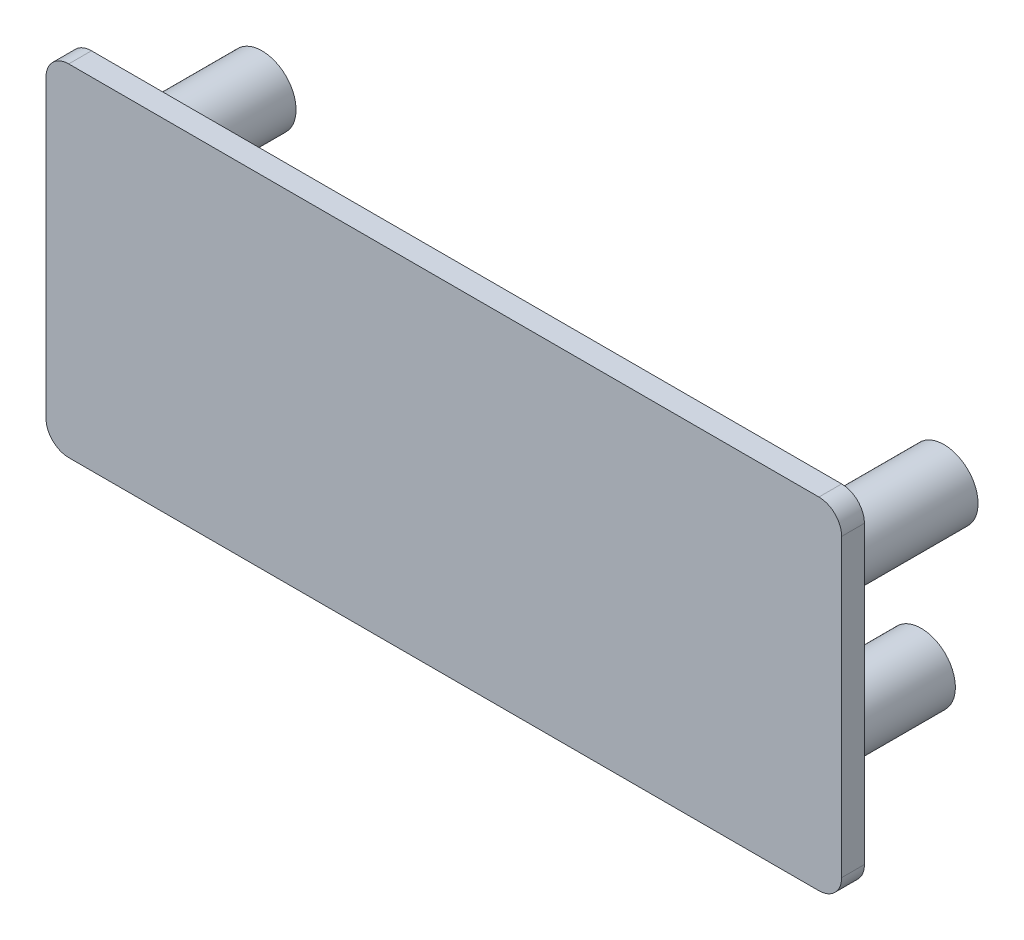
ISO-10303-21;
HEADER;
FILE_DESCRIPTION(('STEP AP214'),'2;1');
FILE_NAME('part.step','',(''),(''),'','','');
FILE_SCHEMA(('AUTOMOTIVE_DESIGN { 1 0 10303 214 1 1 1 1 }'));
ENDSEC;
DATA;
#1=APPLICATION_CONTEXT('core data for automotive mechanical design processes');
#2=APPLICATION_PROTOCOL_DEFINITION('international standard','automotive_design',2000,#1);
#3=PRODUCT_CONTEXT('',#1,'mechanical');
#4=PRODUCT('Part','Part','',(#3));
#5=PRODUCT_RELATED_PRODUCT_CATEGORY('part','',(#4));
#6=PRODUCT_DEFINITION_FORMATION('','',#4);
#7=PRODUCT_DEFINITION_CONTEXT('part definition',#1,'design');
#8=PRODUCT_DEFINITION('design','',#6,#7);
#9=PRODUCT_DEFINITION_SHAPE('','',#8);
#10=(LENGTH_UNIT() NAMED_UNIT(*) SI_UNIT(.MILLI.,.METRE.));
#11=(NAMED_UNIT(*) PLANE_ANGLE_UNIT() SI_UNIT($,.RADIAN.));
#12=(NAMED_UNIT(*) SI_UNIT($,.STERADIAN.) SOLID_ANGLE_UNIT());
#13=UNCERTAINTY_MEASURE_WITH_UNIT(LENGTH_MEASURE(1.E-05),#10,'distance_accuracy_value','');
#14=(GEOMETRIC_REPRESENTATION_CONTEXT(3) GLOBAL_UNCERTAINTY_ASSIGNED_CONTEXT((#13)) GLOBAL_UNIT_ASSIGNED_CONTEXT((#10,
#11,#12)) REPRESENTATION_CONTEXT('',''));
#15=CARTESIAN_POINT('',(0.,0.,0.));
#16=DIRECTION('',(0.,0.,1.));
#17=DIRECTION('',(1.,0.,0.));
#18=AXIS2_PLACEMENT_3D('',#15,#16,#17);
#19=CARTESIAN_POINT('',(-33.,-13.,2.));
#20=DIRECTION('',(0.,0.,-1.));
#21=DIRECTION('',(-1.,0.,0.));
#22=AXIS2_PLACEMENT_3D('',#19,#20,#21);
#23=CYLINDRICAL_SURFACE('',#22,2.);
#24=CARTESIAN_POINT('',(-33.,-13.,0.));
#25=DIRECTION('',(0.,0.,1.));
#26=DIRECTION('',(-1.,0.,0.));
#27=AXIS2_PLACEMENT_3D('',#24,#25,#26);
#28=CIRCLE('',#27,2.);
#29=CARTESIAN_POINT('',(-35.,-13.,0.));
#30=VERTEX_POINT('',#29);
#31=CARTESIAN_POINT('',(-33.,-15.,0.));
#32=VERTEX_POINT('',#31);
#33=EDGE_CURVE('E136',#30,#32,#28,.T.);
#34=ORIENTED_EDGE('',*,*,#33,.T.);
#35=DIRECTION('',(0.,0.,-1.));
#36=VECTOR('',#35,1.);
#37=CARTESIAN_POINT('',(-33.,-15.,2.));
#38=LINE('',#37,#36);
#39=CARTESIAN_POINT('',(-33.,-15.,2.));
#40=VERTEX_POINT('',#39);
#41=EDGE_CURVE('E164',#40,#32,#38,.T.);
#42=ORIENTED_EDGE('',*,*,#41,.F.);
#43=CARTESIAN_POINT('',(-33.,-13.,2.));
#44=DIRECTION('',(0.,0.,1.));
#45=DIRECTION('',(-1.,0.,0.));
#46=AXIS2_PLACEMENT_3D('',#43,#44,#45);
#47=CIRCLE('',#46,2.);
#48=CARTESIAN_POINT('',(-35.,-13.,2.));
#49=VERTEX_POINT('',#48);
#50=EDGE_CURVE('E151',#49,#40,#47,.T.);
#51=ORIENTED_EDGE('',*,*,#50,.F.);
#52=DIRECTION('',(0.,0.,-1.));
#53=VECTOR('',#52,1.);
#54=CARTESIAN_POINT('',(-35.,-13.,2.));
#55=LINE('',#54,#53);
#56=EDGE_CURVE('E132',#49,#30,#55,.T.);
#57=ORIENTED_EDGE('',*,*,#56,.T.);
#58=EDGE_LOOP('',(#34,#42,#51,#57));
#59=FACE_BOUND('',#58,.T.);
#60=ADVANCED_FACE('F39',(#59),#23,.T.);
#61=CARTESIAN_POINT('',(-33.,-15.,2.));
#62=DIRECTION('',(0.,1.,0.));
#63=DIRECTION('',(0.,0.,1.));
#64=AXIS2_PLACEMENT_3D('',#61,#62,#63);
#65=PLANE('',#64);
#66=DIRECTION('',(1.,0.,0.));
#67=VECTOR('',#66,1.);
#68=CARTESIAN_POINT('',(-33.,-15.,0.));
#69=LINE('',#68,#67);
#70=CARTESIAN_POINT('',(33.,-15.,0.));
#71=VERTEX_POINT('',#70);
#72=EDGE_CURVE('E139',#32,#71,#69,.T.);
#73=ORIENTED_EDGE('',*,*,#72,.T.);
#74=DIRECTION('',(0.,0.,-1.));
#75=VECTOR('',#74,1.);
#76=CARTESIAN_POINT('',(33.,-15.,2.));
#77=LINE('',#76,#75);
#78=CARTESIAN_POINT('',(33.,-15.,2.));
#79=VERTEX_POINT('',#78);
#80=EDGE_CURVE('E161',#79,#71,#77,.T.);
#81=ORIENTED_EDGE('',*,*,#80,.F.);
#82=DIRECTION('',(1.,0.,0.));
#83=VECTOR('',#82,1.);
#84=CARTESIAN_POINT('',(-33.,-15.,2.));
#85=LINE('',#84,#83);
#86=EDGE_CURVE('E99',#40,#79,#85,.T.);
#87=ORIENTED_EDGE('',*,*,#86,.F.);
#88=ORIENTED_EDGE('',*,*,#41,.T.);
#89=EDGE_LOOP('',(#73,#81,#87,#88));
#90=FACE_BOUND('',#89,.T.);
#91=ADVANCED_FACE('F204',(#90),#65,.F.);
#92=CARTESIAN_POINT('',(33.,-13.,2.));
#93=DIRECTION('',(0.,0.,-1.));
#94=DIRECTION('',(-1.,0.,0.));
#95=AXIS2_PLACEMENT_3D('',#92,#93,#94);
#96=CYLINDRICAL_SURFACE('',#95,2.);
#97=CARTESIAN_POINT('',(33.,-13.,0.));
#98=DIRECTION('',(0.,0.,1.));
#99=DIRECTION('',(1.,0.,0.));
#100=AXIS2_PLACEMENT_3D('',#97,#98,#99);
#101=CIRCLE('',#100,2.);
#102=CARTESIAN_POINT('',(35.,-13.,0.));
#103=VERTEX_POINT('',#102);
#104=EDGE_CURVE('E142',#71,#103,#101,.T.);
#105=ORIENTED_EDGE('',*,*,#104,.T.);
#106=DIRECTION('',(0.,0.,-1.));
#107=VECTOR('',#106,1.);
#108=CARTESIAN_POINT('',(35.,-13.,2.));
#109=LINE('',#108,#107);
#110=CARTESIAN_POINT('',(35.,-13.,2.));
#111=VERTEX_POINT('',#110);
#112=EDGE_CURVE('E158',#111,#103,#109,.T.);
#113=ORIENTED_EDGE('',*,*,#112,.F.);
#114=CARTESIAN_POINT('',(33.,-13.,2.));
#115=DIRECTION('',(0.,0.,1.));
#116=DIRECTION('',(1.,0.,0.));
#117=AXIS2_PLACEMENT_3D('',#114,#115,#116);
#118=CIRCLE('',#117,2.);
#119=EDGE_CURVE('E219',#79,#111,#118,.T.);
#120=ORIENTED_EDGE('',*,*,#119,.F.);
#121=ORIENTED_EDGE('',*,*,#80,.T.);
#122=EDGE_LOOP('',(#105,#113,#120,#121));
#123=FACE_BOUND('',#122,.T.);
#124=ADVANCED_FACE('F209',(#123),#96,.T.);
#125=CARTESIAN_POINT('',(35.,-13.,2.));
#126=DIRECTION('',(-1.,0.,0.));
#127=DIRECTION('',(0.,0.,1.));
#128=AXIS2_PLACEMENT_3D('',#125,#126,#127);
#129=PLANE('',#128);
#130=DIRECTION('',(0.,1.,0.));
#131=VECTOR('',#130,1.);
#132=CARTESIAN_POINT('',(35.,-13.,0.));
#133=LINE('',#132,#131);
#134=CARTESIAN_POINT('',(35.,13.,0.));
#135=VERTEX_POINT('',#134);
#136=EDGE_CURVE('E144',#103,#135,#133,.T.);
#137=ORIENTED_EDGE('',*,*,#136,.T.);
#138=DIRECTION('',(0.,0.,-1.));
#139=VECTOR('',#138,1.);
#140=CARTESIAN_POINT('',(35.,13.,2.));
#141=LINE('',#140,#139);
#142=CARTESIAN_POINT('',(35.,13.,2.));
#143=VERTEX_POINT('',#142);
#144=EDGE_CURVE('E155',#143,#135,#141,.T.);
#145=ORIENTED_EDGE('',*,*,#144,.F.);
#146=DIRECTION('',(0.,1.,0.));
#147=VECTOR('',#146,1.);
#148=CARTESIAN_POINT('',(35.,-13.,2.));
#149=LINE('',#148,#147);
#150=EDGE_CURVE('E221',#111,#143,#149,.T.);
#151=ORIENTED_EDGE('',*,*,#150,.F.);
#152=ORIENTED_EDGE('',*,*,#112,.T.);
#153=EDGE_LOOP('',(#137,#145,#151,#152));
#154=FACE_BOUND('',#153,.T.);
#155=ADVANCED_FACE('F300',(#154),#129,.F.);
#156=CARTESIAN_POINT('',(33.,13.,2.));
#157=DIRECTION('',(0.,0.,-1.));
#158=DIRECTION('',(-1.,0.,0.));
#159=AXIS2_PLACEMENT_3D('',#156,#157,#158);
#160=CYLINDRICAL_SURFACE('',#159,2.);
#161=CARTESIAN_POINT('',(33.,13.,0.));
#162=DIRECTION('',(0.,0.,1.));
#163=DIRECTION('',(-1.,0.,0.));
#164=AXIS2_PLACEMENT_3D('',#161,#162,#163);
#165=CIRCLE('',#164,2.);
#166=CARTESIAN_POINT('',(33.,15.,0.));
#167=VERTEX_POINT('',#166);
#168=EDGE_CURVE('E146',#135,#167,#165,.T.);
#169=ORIENTED_EDGE('',*,*,#168,.T.);
#170=DIRECTION('',(0.,0.,-1.));
#171=VECTOR('',#170,1.);
#172=CARTESIAN_POINT('',(33.,15.,2.));
#173=LINE('',#172,#171);
#174=CARTESIAN_POINT('',(33.,15.,2.));
#175=VERTEX_POINT('',#174);
#176=EDGE_CURVE('E127',#175,#167,#173,.T.);
#177=ORIENTED_EDGE('',*,*,#176,.F.);
#178=CARTESIAN_POINT('',(33.,13.,2.));
#179=DIRECTION('',(0.,0.,1.));
#180=DIRECTION('',(-1.,0.,0.));
#181=AXIS2_PLACEMENT_3D('',#178,#179,#180);
#182=CIRCLE('',#181,2.);
#183=EDGE_CURVE('E118',#143,#175,#182,.T.);
#184=ORIENTED_EDGE('',*,*,#183,.F.);
#185=ORIENTED_EDGE('',*,*,#144,.T.);
#186=EDGE_LOOP('',(#169,#177,#184,#185));
#187=FACE_BOUND('',#186,.T.);
#188=ADVANCED_FACE('F297',(#187),#160,.T.);
#189=CARTESIAN_POINT('',(-33.,15.,2.));
#190=DIRECTION('',(0.,-1.,0.));
#191=DIRECTION('',(0.,0.,-1.));
#192=AXIS2_PLACEMENT_3D('',#189,#190,#191);
#193=PLANE('',#192);
#194=DIRECTION('',(-1.,0.,0.));
#195=VECTOR('',#194,1.);
#196=CARTESIAN_POINT('',(-33.,15.,0.));
#197=LINE('',#196,#195);
#198=CARTESIAN_POINT('',(-33.,15.,0.));
#199=VERTEX_POINT('',#198);
#200=EDGE_CURVE('E126',#167,#199,#197,.T.);
#201=ORIENTED_EDGE('',*,*,#200,.T.);
#202=DIRECTION('',(0.,0.,-1.));
#203=VECTOR('',#202,1.);
#204=CARTESIAN_POINT('',(-33.,15.,2.));
#205=LINE('',#204,#203);
#206=CARTESIAN_POINT('',(-33.,15.,2.));
#207=VERTEX_POINT('',#206);
#208=EDGE_CURVE('E123',#207,#199,#205,.T.);
#209=ORIENTED_EDGE('',*,*,#208,.F.);
#210=DIRECTION('',(-1.,0.,0.));
#211=VECTOR('',#210,1.);
#212=CARTESIAN_POINT('',(-33.,15.,2.));
#213=LINE('',#212,#211);
#214=EDGE_CURVE('E112',#175,#207,#213,.T.);
#215=ORIENTED_EDGE('',*,*,#214,.F.);
#216=ORIENTED_EDGE('',*,*,#176,.T.);
#217=EDGE_LOOP('',(#201,#209,#215,#216));
#218=FACE_BOUND('',#217,.T.);
#219=ADVANCED_FACE('F124',(#218),#193,.F.);
#220=CARTESIAN_POINT('',(-33.,13.,2.));
#221=DIRECTION('',(0.,0.,-1.));
#222=DIRECTION('',(-1.,0.,0.));
#223=AXIS2_PLACEMENT_3D('',#220,#221,#222);
#224=CYLINDRICAL_SURFACE('',#223,2.);
#225=CARTESIAN_POINT('',(-33.,13.,0.));
#226=DIRECTION('',(0.,0.,1.));
#227=DIRECTION('',(-1.,0.,0.));
#228=AXIS2_PLACEMENT_3D('',#225,#226,#227);
#229=CIRCLE('',#228,2.);
#230=CARTESIAN_POINT('',(-35.,13.,0.));
#231=VERTEX_POINT('',#230);
#232=EDGE_CURVE('E84',#199,#231,#229,.T.);
#233=ORIENTED_EDGE('',*,*,#232,.T.);
#234=DIRECTION('',(0.,0.,-1.));
#235=VECTOR('',#234,1.);
#236=CARTESIAN_POINT('',(-35.,13.,2.));
#237=LINE('',#236,#235);
#238=CARTESIAN_POINT('',(-35.,13.,2.));
#239=VERTEX_POINT('',#238);
#240=EDGE_CURVE('E128',#239,#231,#237,.T.);
#241=ORIENTED_EDGE('',*,*,#240,.F.);
#242=CARTESIAN_POINT('',(-33.,13.,2.));
#243=DIRECTION('',(0.,0.,1.));
#244=DIRECTION('',(-1.,0.,0.));
#245=AXIS2_PLACEMENT_3D('',#242,#243,#244);
#246=CIRCLE('',#245,2.);
#247=EDGE_CURVE('E116',#207,#239,#246,.T.);
#248=ORIENTED_EDGE('',*,*,#247,.F.);
#249=ORIENTED_EDGE('',*,*,#208,.T.);
#250=EDGE_LOOP('',(#233,#241,#248,#249));
#251=FACE_BOUND('',#250,.T.);
#252=ADVANCED_FACE('F130',(#251),#224,.T.);
#253=CARTESIAN_POINT('',(-35.,-13.,2.));
#254=DIRECTION('',(1.,0.,0.));
#255=DIRECTION('',(0.,0.,-1.));
#256=AXIS2_PLACEMENT_3D('',#253,#254,#255);
#257=PLANE('',#256);
#258=DIRECTION('',(0.,-1.,0.));
#259=VECTOR('',#258,1.);
#260=CARTESIAN_POINT('',(-35.,-13.,0.));
#261=LINE('',#260,#259);
#262=EDGE_CURVE('E90',#231,#30,#261,.T.);
#263=ORIENTED_EDGE('',*,*,#262,.T.);
#264=ORIENTED_EDGE('',*,*,#56,.F.);
#265=DIRECTION('',(0.,-1.,0.));
#266=VECTOR('',#265,1.);
#267=CARTESIAN_POINT('',(-35.,-13.,2.));
#268=LINE('',#267,#266);
#269=EDGE_CURVE('E55',#239,#49,#268,.T.);
#270=ORIENTED_EDGE('',*,*,#269,.F.);
#271=ORIENTED_EDGE('',*,*,#240,.T.);
#272=EDGE_LOOP('',(#263,#264,#270,#271));
#273=FACE_BOUND('',#272,.T.);
#274=ADVANCED_FACE('F286',(#273),#257,.F.);
#275=CARTESIAN_POINT('',(-33.,-13.,2.));
#276=DIRECTION('',(0.,0.,-1.));
#277=DIRECTION('',(-1.,0.,0.));
#278=AXIS2_PLACEMENT_3D('',#275,#276,#277);
#279=PLANE('',#278);
#280=ORIENTED_EDGE('',*,*,#50,.T.);
#281=ORIENTED_EDGE('',*,*,#86,.T.);
#282=ORIENTED_EDGE('',*,*,#119,.T.);
#283=ORIENTED_EDGE('',*,*,#150,.T.);
#284=ORIENTED_EDGE('',*,*,#183,.T.);
#285=ORIENTED_EDGE('',*,*,#214,.T.);
#286=ORIENTED_EDGE('',*,*,#247,.T.);
#287=ORIENTED_EDGE('',*,*,#269,.T.);
#288=EDGE_LOOP('',(#280,#281,#282,#283,#284,#285,#286,#287));
#289=FACE_BOUND('',#288,.T.);
#290=ADVANCED_FACE('F114',(#289),#279,.F.);
#291=CARTESIAN_POINT('',(-33.,-13.,0.));
#292=DIRECTION('',(0.,0.,-1.));
#293=DIRECTION('',(-1.,0.,0.));
#294=AXIS2_PLACEMENT_3D('',#291,#292,#293);
#295=PLANE('',#294);
#296=CARTESIAN_POINT('',(28.,-7.50000000000001,0.));
#297=DIRECTION('',(0.,0.,-1.));
#298=DIRECTION('',(-1.,0.,0.));
#299=AXIS2_PLACEMENT_3D('',#296,#297,#298);
#300=CIRCLE('',#299,3.);
#301=CARTESIAN_POINT('',(25.,-7.50000000000001,0.));
#302=VERTEX_POINT('',#301);
#303=EDGE_CURVE('E240',#302,#302,#300,.T.);
#304=ORIENTED_EDGE('',*,*,#303,.F.);
#305=EDGE_LOOP('',(#304));
#306=FACE_BOUND('',#305,.T.);
#307=CARTESIAN_POINT('',(30.,7.5,0.));
#308=DIRECTION('',(0.,0.,-1.));
#309=DIRECTION('',(-1.,0.,0.));
#310=AXIS2_PLACEMENT_3D('',#307,#308,#309);
#311=CIRCLE('',#310,2.99999999999999);
#312=CARTESIAN_POINT('',(27.,7.5,0.));
#313=VERTEX_POINT('',#312);
#314=EDGE_CURVE('E250',#313,#313,#311,.T.);
#315=ORIENTED_EDGE('',*,*,#314,.F.);
#316=EDGE_LOOP('',(#315));
#317=FACE_BOUND('',#316,.T.);
#318=CARTESIAN_POINT('',(-30.,7.5,0.));
#319=DIRECTION('',(0.,0.,-1.));
#320=DIRECTION('',(-1.,0.,0.));
#321=AXIS2_PLACEMENT_3D('',#318,#319,#320);
#322=CIRCLE('',#321,3.);
#323=CARTESIAN_POINT('',(-33.,7.5,0.));
#324=VERTEX_POINT('',#323);
#325=EDGE_CURVE('E257',#324,#324,#322,.T.);
#326=ORIENTED_EDGE('',*,*,#325,.F.);
#327=EDGE_LOOP('',(#326));
#328=FACE_BOUND('',#327,.T.);
#329=CARTESIAN_POINT('',(-28.,-7.5,0.));
#330=DIRECTION('',(0.,0.,-1.));
#331=DIRECTION('',(-1.,0.,0.));
#332=AXIS2_PLACEMENT_3D('',#329,#330,#331);
#333=CIRCLE('',#332,3.);
#334=CARTESIAN_POINT('',(-31.,-7.5,0.));
#335=VERTEX_POINT('',#334);
#336=EDGE_CURVE('E227',#335,#335,#333,.T.);
#337=ORIENTED_EDGE('',*,*,#336,.F.);
#338=EDGE_LOOP('',(#337));
#339=FACE_BOUND('',#338,.T.);
#340=ORIENTED_EDGE('',*,*,#33,.F.);
#341=ORIENTED_EDGE('',*,*,#262,.F.);
#342=ORIENTED_EDGE('',*,*,#232,.F.);
#343=ORIENTED_EDGE('',*,*,#200,.F.);
#344=ORIENTED_EDGE('',*,*,#168,.F.);
#345=ORIENTED_EDGE('',*,*,#136,.F.);
#346=ORIENTED_EDGE('',*,*,#104,.F.);
#347=ORIENTED_EDGE('',*,*,#72,.F.);
#348=EDGE_LOOP('',(#340,#341,#342,#343,#344,#345,#346,#347));
#349=FACE_BOUND('',#348,.T.);
#350=ADVANCED_FACE('F192',(#306,#317,#328,#339,#349),#295,.T.);
#351=CARTESIAN_POINT('',(-28.,-7.5,-12.));
#352=DIRECTION('',(0.,0.,-1.));
#353=DIRECTION('',(-1.,0.,0.));
#354=AXIS2_PLACEMENT_3D('',#351,#352,#353);
#355=PLANE('',#354);
#356=CARTESIAN_POINT('',(-28.,-7.5,-12.));
#357=DIRECTION('',(0.,0.,-1.));
#358=DIRECTION('',(-1.,0.,0.));
#359=AXIS2_PLACEMENT_3D('',#356,#357,#358);
#360=CIRCLE('',#359,3.);
#361=CARTESIAN_POINT('',(-31.,-7.5,-12.));
#362=VERTEX_POINT('',#361);
#363=EDGE_CURVE('E140',#362,#362,#360,.T.);
#364=ORIENTED_EDGE('',*,*,#363,.T.);
#365=EDGE_LOOP('',(#364));
#366=FACE_BOUND('',#365,.T.);
#367=CARTESIAN_POINT('',(-28.,-7.5,-12.));
#368=DIRECTION('',(0.,0.,-1.));
#369=DIRECTION('',(-1.,0.,0.));
#370=AXIS2_PLACEMENT_3D('',#367,#368,#369);
#371=CIRCLE('',#370,1.95);
#372=CARTESIAN_POINT('',(-29.95,-7.5,-12.));
#373=VERTEX_POINT('',#372);
#374=EDGE_CURVE('E230',#373,#373,#371,.T.);
#375=ORIENTED_EDGE('',*,*,#374,.F.);
#376=EDGE_LOOP('',(#375));
#377=FACE_BOUND('',#376,.T.);
#378=ADVANCED_FACE('F267',(#366,#377),#355,.T.);
#379=CARTESIAN_POINT('',(-28.,-7.5,-12.));
#380=DIRECTION('',(0.,0.,1.));
#381=DIRECTION('',(1.,0.,0.));
#382=AXIS2_PLACEMENT_3D('',#379,#380,#381);
#383=CYLINDRICAL_SURFACE('',#382,3.);
#384=ORIENTED_EDGE('',*,*,#363,.F.);
#385=EDGE_LOOP('',(#384));
#386=FACE_BOUND('',#385,.T.);
#387=ORIENTED_EDGE('',*,*,#336,.T.);
#388=EDGE_LOOP('',(#387));
#389=FACE_BOUND('',#388,.T.);
#390=ADVANCED_FACE('F271',(#386,#389),#383,.T.);
#391=CARTESIAN_POINT('',(-28.,-7.5,-12.));
#392=DIRECTION('',(0.,0.,1.));
#393=DIRECTION('',(1.,0.,0.));
#394=AXIS2_PLACEMENT_3D('',#391,#392,#393);
#395=CYLINDRICAL_SURFACE('',#394,1.95);
#396=ORIENTED_EDGE('',*,*,#374,.T.);
#397=EDGE_LOOP('',(#396));
#398=FACE_BOUND('',#397,.T.);
#399=CARTESIAN_POINT('',(-28.,-7.5,0.));
#400=DIRECTION('',(0.,0.,-1.));
#401=DIRECTION('',(-1.,0.,0.));
#402=AXIS2_PLACEMENT_3D('',#399,#400,#401);
#403=CIRCLE('',#402,1.95);
#404=CARTESIAN_POINT('',(-29.95,-7.5,0.));
#405=VERTEX_POINT('',#404);
#406=EDGE_CURVE('E166',#405,#405,#403,.F.);
#407=ORIENTED_EDGE('',*,*,#406,.T.);
#408=EDGE_LOOP('',(#407));
#409=FACE_BOUND('',#408,.T.);
#410=ADVANCED_FACE('F273',(#398,#409),#395,.F.);
#411=ORIENTED_EDGE('',*,*,#406,.F.);
#412=EDGE_LOOP('',(#411));
#413=FACE_BOUND('',#412,.T.);
#414=ADVANCED_FACE('F199',(#413),#295,.T.);
#415=CARTESIAN_POINT('',(-30.,7.5,-12.));
#416=DIRECTION('',(0.,0.,-1.));
#417=DIRECTION('',(-1.,0.,0.));
#418=AXIS2_PLACEMENT_3D('',#415,#416,#417);
#419=PLANE('',#418);
#420=CARTESIAN_POINT('',(-30.,7.5,-12.));
#421=DIRECTION('',(0.,0.,-1.));
#422=DIRECTION('',(-1.,0.,0.));
#423=AXIS2_PLACEMENT_3D('',#420,#421,#422);
#424=CIRCLE('',#423,3.);
#425=CARTESIAN_POINT('',(-33.,7.5,-12.));
#426=VERTEX_POINT('',#425);
#427=EDGE_CURVE('E249',#426,#426,#424,.T.);
#428=ORIENTED_EDGE('',*,*,#427,.T.);
#429=EDGE_LOOP('',(#428));
#430=FACE_BOUND('',#429,.T.);
#431=CARTESIAN_POINT('',(-30.,7.5,-12.));
#432=DIRECTION('',(0.,0.,-1.));
#433=DIRECTION('',(-1.,0.,0.));
#434=AXIS2_PLACEMENT_3D('',#431,#432,#433);
#435=CIRCLE('',#434,1.95);
#436=CARTESIAN_POINT('',(-31.95,7.5,-12.));
#437=VERTEX_POINT('',#436);
#438=EDGE_CURVE('E235',#437,#437,#435,.T.);
#439=ORIENTED_EDGE('',*,*,#438,.F.);
#440=EDGE_LOOP('',(#439));
#441=FACE_BOUND('',#440,.T.);
#442=ADVANCED_FACE('F354',(#430,#441),#419,.T.);
#443=CARTESIAN_POINT('',(-30.,7.5,-12.));
#444=DIRECTION('',(0.,0.,1.));
#445=DIRECTION('',(1.,0.,0.));
#446=AXIS2_PLACEMENT_3D('',#443,#444,#445);
#447=CYLINDRICAL_SURFACE('',#446,3.);
#448=ORIENTED_EDGE('',*,*,#427,.F.);
#449=EDGE_LOOP('',(#448));
#450=FACE_BOUND('',#449,.T.);
#451=ORIENTED_EDGE('',*,*,#325,.T.);
#452=EDGE_LOOP('',(#451));
#453=FACE_BOUND('',#452,.T.);
#454=ADVANCED_FACE('F263',(#450,#453),#447,.T.);
#455=CARTESIAN_POINT('',(-30.,7.5,-12.));
#456=DIRECTION('',(0.,0.,1.));
#457=DIRECTION('',(1.,0.,0.));
#458=AXIS2_PLACEMENT_3D('',#455,#456,#457);
#459=CYLINDRICAL_SURFACE('',#458,1.95);
#460=ORIENTED_EDGE('',*,*,#438,.T.);
#461=EDGE_LOOP('',(#460));
#462=FACE_BOUND('',#461,.T.);
#463=CARTESIAN_POINT('',(-30.,7.5,0.));
#464=DIRECTION('',(0.,0.,-1.));
#465=DIRECTION('',(-1.,0.,0.));
#466=AXIS2_PLACEMENT_3D('',#463,#464,#465);
#467=CIRCLE('',#466,1.95);
#468=CARTESIAN_POINT('',(-31.95,7.5,0.));
#469=VERTEX_POINT('',#468);
#470=EDGE_CURVE('E169',#469,#469,#467,.F.);
#471=ORIENTED_EDGE('',*,*,#470,.T.);
#472=EDGE_LOOP('',(#471));
#473=FACE_BOUND('',#472,.T.);
#474=ADVANCED_FACE('F197',(#462,#473),#459,.F.);
#475=ORIENTED_EDGE('',*,*,#470,.F.);
#476=EDGE_LOOP('',(#475));
#477=FACE_BOUND('',#476,.T.);
#478=ADVANCED_FACE('F180',(#477),#295,.T.);
#479=CARTESIAN_POINT('',(30.,7.5,-12.));
#480=DIRECTION('',(0.,0.,-1.));
#481=DIRECTION('',(-1.,0.,0.));
#482=AXIS2_PLACEMENT_3D('',#479,#480,#481);
#483=PLANE('',#482);
#484=CARTESIAN_POINT('',(30.,7.5,-12.));
#485=DIRECTION('',(0.,0.,-1.));
#486=DIRECTION('',(-1.,0.,0.));
#487=AXIS2_PLACEMENT_3D('',#484,#485,#486);
#488=CIRCLE('',#487,2.99999999999999);
#489=CARTESIAN_POINT('',(27.,7.5,-12.));
#490=VERTEX_POINT('',#489);
#491=EDGE_CURVE('E239',#490,#490,#488,.T.);
#492=ORIENTED_EDGE('',*,*,#491,.T.);
#493=EDGE_LOOP('',(#492));
#494=FACE_BOUND('',#493,.T.);
#495=CARTESIAN_POINT('',(30.,7.5,-12.));
#496=DIRECTION('',(0.,0.,-1.));
#497=DIRECTION('',(-1.,0.,0.));
#498=AXIS2_PLACEMENT_3D('',#495,#496,#497);
#499=CIRCLE('',#498,1.95);
#500=CARTESIAN_POINT('',(28.05,7.5,-12.));
#501=VERTEX_POINT('',#500);
#502=EDGE_CURVE('E246',#501,#501,#499,.T.);
#503=ORIENTED_EDGE('',*,*,#502,.F.);
#504=EDGE_LOOP('',(#503));
#505=FACE_BOUND('',#504,.T.);
#506=ADVANCED_FACE('F196',(#494,#505),#483,.T.);
#507=CARTESIAN_POINT('',(30.,7.5,-12.));
#508=DIRECTION('',(0.,0.,1.));
#509=DIRECTION('',(1.,0.,0.));
#510=AXIS2_PLACEMENT_3D('',#507,#508,#509);
#511=CYLINDRICAL_SURFACE('',#510,2.99999999999999);
#512=ORIENTED_EDGE('',*,*,#491,.F.);
#513=EDGE_LOOP('',(#512));
#514=FACE_BOUND('',#513,.T.);
#515=ORIENTED_EDGE('',*,*,#314,.T.);
#516=EDGE_LOOP('',(#515));
#517=FACE_BOUND('',#516,.T.);
#518=ADVANCED_FACE('F189',(#514,#517),#511,.T.);
#519=CARTESIAN_POINT('',(30.,7.5,-12.));
#520=DIRECTION('',(0.,0.,1.));
#521=DIRECTION('',(1.,0.,0.));
#522=AXIS2_PLACEMENT_3D('',#519,#520,#521);
#523=CYLINDRICAL_SURFACE('',#522,1.95);
#524=ORIENTED_EDGE('',*,*,#502,.T.);
#525=EDGE_LOOP('',(#524));
#526=FACE_BOUND('',#525,.T.);
#527=CARTESIAN_POINT('',(30.,7.5,0.));
#528=DIRECTION('',(0.,0.,-1.));
#529=DIRECTION('',(-1.,0.,0.));
#530=AXIS2_PLACEMENT_3D('',#527,#528,#529);
#531=CIRCLE('',#530,1.95);
#532=CARTESIAN_POINT('',(28.05,7.5,0.));
#533=VERTEX_POINT('',#532);
#534=EDGE_CURVE('E47',#533,#533,#531,.F.);
#535=ORIENTED_EDGE('',*,*,#534,.T.);
#536=EDGE_LOOP('',(#535));
#537=FACE_BOUND('',#536,.T.);
#538=ADVANCED_FACE('F174',(#526,#537),#523,.F.);
#539=ORIENTED_EDGE('',*,*,#534,.F.);
#540=EDGE_LOOP('',(#539));
#541=FACE_BOUND('',#540,.T.);
#542=ADVANCED_FACE('F176',(#541),#295,.T.);
#543=CARTESIAN_POINT('',(28.,-7.50000000000001,-12.));
#544=DIRECTION('',(0.,0.,-1.));
#545=DIRECTION('',(-1.,0.,0.));
#546=AXIS2_PLACEMENT_3D('',#543,#544,#545);
#547=PLANE('',#546);
#548=CARTESIAN_POINT('',(28.,-7.50000000000001,-12.));
#549=DIRECTION('',(0.,0.,-1.));
#550=DIRECTION('',(-1.,0.,0.));
#551=AXIS2_PLACEMENT_3D('',#548,#549,#550);
#552=CIRCLE('',#551,3.);
#553=CARTESIAN_POINT('',(25.,-7.50000000000001,-12.));
#554=VERTEX_POINT('',#553);
#555=EDGE_CURVE('E241',#554,#554,#552,.T.);
#556=ORIENTED_EDGE('',*,*,#555,.T.);
#557=EDGE_LOOP('',(#556));
#558=FACE_BOUND('',#557,.T.);
#559=CARTESIAN_POINT('',(28.,-7.50000000000001,-12.));
#560=DIRECTION('',(0.,0.,-1.));
#561=DIRECTION('',(-1.,0.,0.));
#562=AXIS2_PLACEMENT_3D('',#559,#560,#561);
#563=CIRCLE('',#562,1.95);
#564=CARTESIAN_POINT('',(26.05,-7.50000000000001,-12.));
#565=VERTEX_POINT('',#564);
#566=EDGE_CURVE('E236',#565,#565,#563,.T.);
#567=ORIENTED_EDGE('',*,*,#566,.F.);
#568=EDGE_LOOP('',(#567));
#569=FACE_BOUND('',#568,.T.);
#570=ADVANCED_FACE('F178',(#558,#569),#547,.T.);
#571=CARTESIAN_POINT('',(28.,-7.50000000000001,-12.));
#572=DIRECTION('',(0.,0.,1.));
#573=DIRECTION('',(1.,0.,0.));
#574=AXIS2_PLACEMENT_3D('',#571,#572,#573);
#575=CYLINDRICAL_SURFACE('',#574,3.);
#576=ORIENTED_EDGE('',*,*,#555,.F.);
#577=EDGE_LOOP('',(#576));
#578=FACE_BOUND('',#577,.T.);
#579=ORIENTED_EDGE('',*,*,#303,.T.);
#580=EDGE_LOOP('',(#579));
#581=FACE_BOUND('',#580,.T.);
#582=ADVANCED_FACE('F186',(#578,#581),#575,.T.);
#583=CARTESIAN_POINT('',(28.,-7.50000000000001,-12.));
#584=DIRECTION('',(0.,0.,1.));
#585=DIRECTION('',(1.,0.,0.));
#586=AXIS2_PLACEMENT_3D('',#583,#584,#585);
#587=CYLINDRICAL_SURFACE('',#586,1.95);
#588=ORIENTED_EDGE('',*,*,#566,.T.);
#589=EDGE_LOOP('',(#588));
#590=FACE_BOUND('',#589,.T.);
#591=CARTESIAN_POINT('',(28.,-7.50000000000001,0.));
#592=DIRECTION('',(0.,0.,-1.));
#593=DIRECTION('',(-1.,0.,0.));
#594=AXIS2_PLACEMENT_3D('',#591,#592,#593);
#595=CIRCLE('',#594,1.95);
#596=CARTESIAN_POINT('',(26.05,-7.50000000000001,0.));
#597=VERTEX_POINT('',#596);
#598=EDGE_CURVE('E11',#597,#597,#595,.F.);
#599=ORIENTED_EDGE('',*,*,#598,.T.);
#600=EDGE_LOOP('',(#599));
#601=FACE_BOUND('',#600,.T.);
#602=ADVANCED_FACE('F201',(#590,#601),#587,.F.);
#603=ORIENTED_EDGE('',*,*,#598,.F.);
#604=EDGE_LOOP('',(#603));
#605=FACE_BOUND('',#604,.T.);
#606=ADVANCED_FACE('F181',(#605),#295,.T.);
#607=CLOSED_SHELL('',(#60,#91,#124,#155,#188,#219,#252,#274,#290,#350,#378,#390,#410,#414,#442,
#454,#474,#478,#506,#518,#538,#542,#570,#582,#602,#606));
#608=MANIFOLD_SOLID_BREP('B2',#607);
#609=ADVANCED_BREP_SHAPE_REPRESENTATION('',(#18,#608),#14);
#610=SHAPE_DEFINITION_REPRESENTATION(#9,#609);
ENDSEC;
END-ISO-10303-21;
